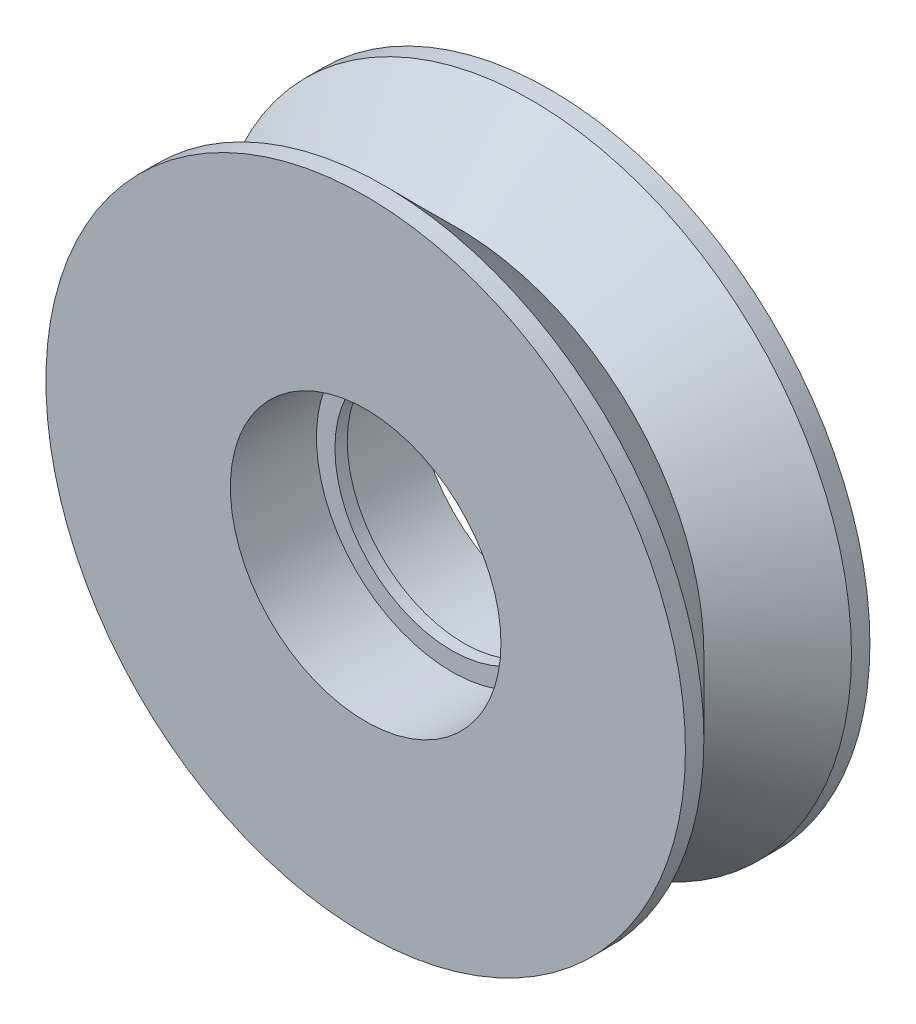
ISO-10303-21;
HEADER;
FILE_DESCRIPTION(('STEP AP214'),'2;1');
FILE_NAME('part.step','',(''),(''),'','','');
FILE_SCHEMA(('AUTOMOTIVE_DESIGN { 1 0 10303 214 1 1 1 1 }'));
ENDSEC;
DATA;
#1=APPLICATION_CONTEXT('core data for automotive mechanical design processes');
#2=APPLICATION_PROTOCOL_DEFINITION('international standard','automotive_design',2000,#1);
#3=PRODUCT_CONTEXT('',#1,'mechanical');
#4=PRODUCT('Part','Part','',(#3));
#5=PRODUCT_RELATED_PRODUCT_CATEGORY('part','',(#4));
#6=PRODUCT_DEFINITION_FORMATION('','',#4);
#7=PRODUCT_DEFINITION_CONTEXT('part definition',#1,'design');
#8=PRODUCT_DEFINITION('design','',#6,#7);
#9=PRODUCT_DEFINITION_SHAPE('','',#8);
#10=(LENGTH_UNIT() NAMED_UNIT(*) SI_UNIT(.MILLI.,.METRE.));
#11=(NAMED_UNIT(*) PLANE_ANGLE_UNIT() SI_UNIT($,.RADIAN.));
#12=(NAMED_UNIT(*) SI_UNIT($,.STERADIAN.) SOLID_ANGLE_UNIT());
#13=UNCERTAINTY_MEASURE_WITH_UNIT(LENGTH_MEASURE(1.E-05),#10,'distance_accuracy_value','');
#14=(GEOMETRIC_REPRESENTATION_CONTEXT(3) GLOBAL_UNCERTAINTY_ASSIGNED_CONTEXT((#13)) GLOBAL_UNIT_ASSIGNED_CONTEXT((#10,
#11,#12)) REPRESENTATION_CONTEXT('',''));
#15=CARTESIAN_POINT('',(0.,0.,0.));
#16=DIRECTION('',(0.,0.,1.));
#17=DIRECTION('',(1.,0.,0.));
#18=AXIS2_PLACEMENT_3D('',#15,#16,#17);
#19=CARTESIAN_POINT('',(0.,0.,5.));
#20=DIRECTION('',(0.,0.,1.));
#21=DIRECTION('',(1.,0.,0.));
#22=AXIS2_PLACEMENT_3D('',#19,#20,#21);
#23=CYLINDRICAL_SURFACE('',#22,11.);
#24=CARTESIAN_POINT('',(0.,0.,0.));
#25=DIRECTION('',(0.,0.,1.));
#26=DIRECTION('',(1.,0.,0.));
#27=AXIS2_PLACEMENT_3D('',#24,#25,#26);
#28=CIRCLE('',#27,11.);
#29=CARTESIAN_POINT('',(11.,0.,0.));
#30=VERTEX_POINT('',#29);
#31=EDGE_CURVE('E10',#30,#30,#28,.T.);
#32=ORIENTED_EDGE('',*,*,#31,.T.);
#33=EDGE_LOOP('',(#32));
#34=FACE_BOUND('',#33,.T.);
#35=CARTESIAN_POINT('',(0.,0.,-7.));
#36=DIRECTION('',(0.,0.,1.));
#37=DIRECTION('',(1.,0.,0.));
#38=AXIS2_PLACEMENT_3D('',#35,#36,#37);
#39=CIRCLE('',#38,11.);
#40=CARTESIAN_POINT('',(11.,0.,-7.));
#41=VERTEX_POINT('',#40);
#42=EDGE_CURVE('E74',#41,#41,#39,.T.);
#43=ORIENTED_EDGE('',*,*,#42,.F.);
#44=EDGE_LOOP('',(#43));
#45=FACE_BOUND('',#44,.T.);
#46=ADVANCED_FACE('F37',(#34,#45),#23,.F.);
#47=CARTESIAN_POINT('',(11.,0.,0.));
#48=DIRECTION('',(0.,0.,1.));
#49=DIRECTION('',(1.,0.,0.));
#50=AXIS2_PLACEMENT_3D('',#47,#48,#49);
#51=PLANE('',#50);
#52=CARTESIAN_POINT('',(0.,0.,0.));
#53=DIRECTION('',(0.,0.,1.));
#54=DIRECTION('',(1.,0.,0.));
#55=AXIS2_PLACEMENT_3D('',#52,#53,#54);
#56=CIRCLE('',#55,26.);
#57=CARTESIAN_POINT('',(26.,0.,0.));
#58=VERTEX_POINT('',#57);
#59=EDGE_CURVE('E43',#58,#58,#56,.T.);
#60=ORIENTED_EDGE('',*,*,#59,.T.);
#61=EDGE_LOOP('',(#60));
#62=FACE_BOUND('',#61,.T.);
#63=ORIENTED_EDGE('',*,*,#31,.F.);
#64=EDGE_LOOP('',(#63));
#65=FACE_BOUND('',#64,.T.);
#66=ADVANCED_FACE('F82',(#62,#65),#51,.T.);
#67=CARTESIAN_POINT('',(0.,0.,5.));
#68=DIRECTION('',(0.,0.,1.));
#69=DIRECTION('',(1.,0.,0.));
#70=AXIS2_PLACEMENT_3D('',#67,#68,#69);
#71=CYLINDRICAL_SURFACE('',#70,26.);
#72=CARTESIAN_POINT('',(0.,0.,-1.5));
#73=DIRECTION('',(0.,0.,1.));
#74=DIRECTION('',(1.,0.,0.));
#75=AXIS2_PLACEMENT_3D('',#72,#73,#74);
#76=CIRCLE('',#75,26.);
#77=CARTESIAN_POINT('',(26.,0.,-1.5));
#78=VERTEX_POINT('',#77);
#79=EDGE_CURVE('E47',#78,#78,#76,.T.);
#80=ORIENTED_EDGE('',*,*,#79,.T.);
#81=EDGE_LOOP('',(#80));
#82=FACE_BOUND('',#81,.T.);
#83=ORIENTED_EDGE('',*,*,#59,.F.);
#84=EDGE_LOOP('',(#83));
#85=FACE_BOUND('',#84,.T.);
#86=ADVANCED_FACE('F86',(#82,#85),#71,.T.);
#87=CARTESIAN_POINT('',(0.,0.,-1.5));
#88=DIRECTION('',(0.,0.,1.));
#89=DIRECTION('',(1.,0.,0.));
#90=AXIS2_PLACEMENT_3D('',#87,#88,#89);
#91=CONICAL_SURFACE('',#90,26.,0.785398163397448);
#92=CARTESIAN_POINT('',(0.,0.,-7.5));
#93=DIRECTION('',(0.,0.,1.));
#94=DIRECTION('',(1.,0.,0.));
#95=AXIS2_PLACEMENT_3D('',#92,#93,#94);
#96=CIRCLE('',#95,20.);
#97=CARTESIAN_POINT('',(20.,0.,-7.5));
#98=VERTEX_POINT('',#97);
#99=EDGE_CURVE('E51',#98,#98,#96,.T.);
#100=ORIENTED_EDGE('',*,*,#99,.T.);
#101=EDGE_LOOP('',(#100));
#102=FACE_BOUND('',#101,.T.);
#103=ORIENTED_EDGE('',*,*,#79,.F.);
#104=EDGE_LOOP('',(#103));
#105=FACE_BOUND('',#104,.T.);
#106=ADVANCED_FACE('F90',(#102,#105),#91,.T.);
#107=CARTESIAN_POINT('',(0.,0.,-7.5));
#108=DIRECTION('',(0.,0.,-1.));
#109=DIRECTION('',(-1.,0.,0.));
#110=AXIS2_PLACEMENT_3D('',#107,#108,#109);
#111=CONICAL_SURFACE('',#110,20.,0.785398163397448);
#112=CARTESIAN_POINT('',(0.,0.,-13.5));
#113=DIRECTION('',(0.,0.,1.));
#114=DIRECTION('',(1.,0.,0.));
#115=AXIS2_PLACEMENT_3D('',#112,#113,#114);
#116=CIRCLE('',#115,26.);
#117=CARTESIAN_POINT('',(26.,0.,-13.5));
#118=VERTEX_POINT('',#117);
#119=EDGE_CURVE('E56',#118,#118,#116,.T.);
#120=ORIENTED_EDGE('',*,*,#119,.T.);
#121=EDGE_LOOP('',(#120));
#122=FACE_BOUND('',#121,.T.);
#123=ORIENTED_EDGE('',*,*,#99,.F.);
#124=EDGE_LOOP('',(#123));
#125=FACE_BOUND('',#124,.T.);
#126=ADVANCED_FACE('F97',(#122,#125),#111,.T.);
#127=CARTESIAN_POINT('',(0.,0.,5.));
#128=DIRECTION('',(0.,0.,1.));
#129=DIRECTION('',(1.,0.,0.));
#130=AXIS2_PLACEMENT_3D('',#127,#128,#129);
#131=CYLINDRICAL_SURFACE('',#130,26.);
#132=CARTESIAN_POINT('',(0.,0.,-15.));
#133=DIRECTION('',(0.,0.,1.));
#134=DIRECTION('',(1.,0.,0.));
#135=AXIS2_PLACEMENT_3D('',#132,#133,#134);
#136=CIRCLE('',#135,26.);
#137=CARTESIAN_POINT('',(26.,0.,-15.));
#138=VERTEX_POINT('',#137);
#139=EDGE_CURVE('E59',#138,#138,#136,.T.);
#140=ORIENTED_EDGE('',*,*,#139,.T.);
#141=EDGE_LOOP('',(#140));
#142=FACE_BOUND('',#141,.T.);
#143=ORIENTED_EDGE('',*,*,#119,.F.);
#144=EDGE_LOOP('',(#143));
#145=FACE_BOUND('',#144,.T.);
#146=ADVANCED_FACE('F101',(#142,#145),#131,.T.);
#147=CARTESIAN_POINT('',(26.,0.,-15.));
#148=DIRECTION('',(0.,0.,-1.));
#149=DIRECTION('',(-1.,0.,0.));
#150=AXIS2_PLACEMENT_3D('',#147,#148,#149);
#151=PLANE('',#150);
#152=CARTESIAN_POINT('',(0.,0.,-15.));
#153=DIRECTION('',(0.,0.,1.));
#154=DIRECTION('',(1.,0.,0.));
#155=AXIS2_PLACEMENT_3D('',#152,#153,#154);
#156=CIRCLE('',#155,11.);
#157=CARTESIAN_POINT('',(11.,0.,-15.));
#158=VERTEX_POINT('',#157);
#159=EDGE_CURVE('E62',#158,#158,#156,.T.);
#160=ORIENTED_EDGE('',*,*,#159,.T.);
#161=EDGE_LOOP('',(#160));
#162=FACE_BOUND('',#161,.T.);
#163=ORIENTED_EDGE('',*,*,#139,.F.);
#164=EDGE_LOOP('',(#163));
#165=FACE_BOUND('',#164,.T.);
#166=ADVANCED_FACE('F105',(#162,#165),#151,.T.);
#167=CARTESIAN_POINT('',(0.,0.,5.));
#168=DIRECTION('',(0.,0.,1.));
#169=DIRECTION('',(1.,0.,0.));
#170=AXIS2_PLACEMENT_3D('',#167,#168,#169);
#171=CYLINDRICAL_SURFACE('',#170,11.);
#172=CARTESIAN_POINT('',(0.,0.,-8.));
#173=DIRECTION('',(0.,0.,1.));
#174=DIRECTION('',(1.,0.,0.));
#175=AXIS2_PLACEMENT_3D('',#172,#173,#174);
#176=CIRCLE('',#175,11.);
#177=CARTESIAN_POINT('',(11.,0.,-8.));
#178=VERTEX_POINT('',#177);
#179=EDGE_CURVE('E65',#178,#178,#176,.T.);
#180=ORIENTED_EDGE('',*,*,#179,.T.);
#181=EDGE_LOOP('',(#180));
#182=FACE_BOUND('',#181,.T.);
#183=ORIENTED_EDGE('',*,*,#159,.F.);
#184=EDGE_LOOP('',(#183));
#185=FACE_BOUND('',#184,.T.);
#186=ADVANCED_FACE('F109',(#182,#185),#171,.F.);
#187=CARTESIAN_POINT('',(11.,0.,-8.));
#188=DIRECTION('',(0.,0.,-1.));
#189=DIRECTION('',(-1.,0.,0.));
#190=AXIS2_PLACEMENT_3D('',#187,#188,#189);
#191=PLANE('',#190);
#192=CARTESIAN_POINT('',(0.,0.,-8.));
#193=DIRECTION('',(0.,0.,1.));
#194=DIRECTION('',(1.,0.,0.));
#195=AXIS2_PLACEMENT_3D('',#192,#193,#194);
#196=CIRCLE('',#195,9.5);
#197=CARTESIAN_POINT('',(9.5,0.,-8.));
#198=VERTEX_POINT('',#197);
#199=EDGE_CURVE('E68',#198,#198,#196,.T.);
#200=ORIENTED_EDGE('',*,*,#199,.T.);
#201=EDGE_LOOP('',(#200));
#202=FACE_BOUND('',#201,.T.);
#203=ORIENTED_EDGE('',*,*,#179,.F.);
#204=EDGE_LOOP('',(#203));
#205=FACE_BOUND('',#204,.T.);
#206=ADVANCED_FACE('F113',(#202,#205),#191,.T.);
#207=CARTESIAN_POINT('',(0.,0.,5.));
#208=DIRECTION('',(0.,0.,1.));
#209=DIRECTION('',(1.,0.,0.));
#210=AXIS2_PLACEMENT_3D('',#207,#208,#209);
#211=CYLINDRICAL_SURFACE('',#210,9.5);
#212=CARTESIAN_POINT('',(0.,0.,-7.));
#213=DIRECTION('',(0.,0.,1.));
#214=DIRECTION('',(1.,0.,0.));
#215=AXIS2_PLACEMENT_3D('',#212,#213,#214);
#216=CIRCLE('',#215,9.5);
#217=CARTESIAN_POINT('',(9.5,0.,-7.));
#218=VERTEX_POINT('',#217);
#219=EDGE_CURVE('E71',#218,#218,#216,.T.);
#220=ORIENTED_EDGE('',*,*,#219,.T.);
#221=EDGE_LOOP('',(#220));
#222=FACE_BOUND('',#221,.T.);
#223=ORIENTED_EDGE('',*,*,#199,.F.);
#224=EDGE_LOOP('',(#223));
#225=FACE_BOUND('',#224,.T.);
#226=ADVANCED_FACE('F117',(#222,#225),#211,.F.);
#227=CARTESIAN_POINT('',(9.5,0.,-7.));
#228=DIRECTION('',(0.,0.,1.));
#229=DIRECTION('',(1.,0.,0.));
#230=AXIS2_PLACEMENT_3D('',#227,#228,#229);
#231=PLANE('',#230);
#232=ORIENTED_EDGE('',*,*,#42,.T.);
#233=EDGE_LOOP('',(#232));
#234=FACE_BOUND('',#233,.T.);
#235=ORIENTED_EDGE('',*,*,#219,.F.);
#236=EDGE_LOOP('',(#235));
#237=FACE_BOUND('',#236,.T.);
#238=ADVANCED_FACE('F78',(#234,#237),#231,.T.);
#239=CLOSED_SHELL('',(#46,#66,#86,#106,#126,#146,#166,#186,#206,#226,#238));
#240=MANIFOLD_SOLID_BREP('B2',#239);
#241=ADVANCED_BREP_SHAPE_REPRESENTATION('',(#18,#240),#14);
#242=SHAPE_DEFINITION_REPRESENTATION(#9,#241);
ENDSEC;
END-ISO-10303-21;
